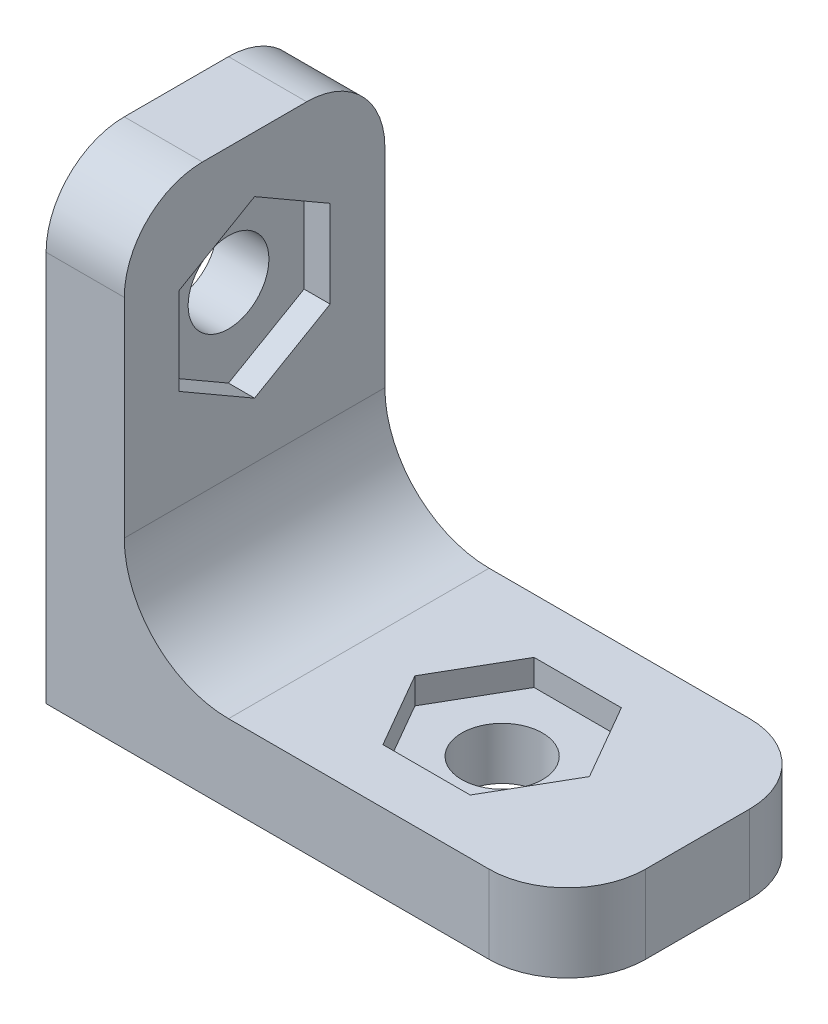
ISO-10303-21;
HEADER;
FILE_DESCRIPTION(('STEP AP214'),'2;1');
FILE_NAME('part.step','',(''),(''),'','','');
FILE_SCHEMA(('AUTOMOTIVE_DESIGN { 1 0 10303 214 1 1 1 1 }'));
ENDSEC;
DATA;
#1=APPLICATION_CONTEXT('core data for automotive mechanical design processes');
#2=APPLICATION_PROTOCOL_DEFINITION('international standard','automotive_design',2000,#1);
#3=PRODUCT_CONTEXT('',#1,'mechanical');
#4=PRODUCT('Part','Part','',(#3));
#5=PRODUCT_RELATED_PRODUCT_CATEGORY('part','',(#4));
#6=PRODUCT_DEFINITION_FORMATION('','',#4);
#7=PRODUCT_DEFINITION_CONTEXT('part definition',#1,'design');
#8=PRODUCT_DEFINITION('design','',#6,#7);
#9=PRODUCT_DEFINITION_SHAPE('','',#8);
#10=(LENGTH_UNIT() NAMED_UNIT(*) SI_UNIT(.MILLI.,.METRE.));
#11=(NAMED_UNIT(*) PLANE_ANGLE_UNIT() SI_UNIT($,.RADIAN.));
#12=(NAMED_UNIT(*) SI_UNIT($,.STERADIAN.) SOLID_ANGLE_UNIT());
#13=UNCERTAINTY_MEASURE_WITH_UNIT(LENGTH_MEASURE(1.E-05),#10,'distance_accuracy_value','');
#14=(GEOMETRIC_REPRESENTATION_CONTEXT(3) GLOBAL_UNCERTAINTY_ASSIGNED_CONTEXT((#13)) GLOBAL_UNIT_ASSIGNED_CONTEXT((#10,
#11,#12)) REPRESENTATION_CONTEXT('',''));
#15=CARTESIAN_POINT('',(0.,0.,0.));
#16=DIRECTION('',(0.,0.,1.));
#17=DIRECTION('',(1.,0.,0.));
#18=AXIS2_PLACEMENT_3D('',#15,#16,#17);
#19=CARTESIAN_POINT('',(12.5,3.,-5.));
#20=DIRECTION('',(0.,-1.,0.));
#21=DIRECTION('',(0.,0.,-1.));
#22=AXIS2_PLACEMENT_3D('',#19,#20,#21);
#23=CYLINDRICAL_SURFACE('',#22,1.55);
#24=CARTESIAN_POINT('',(12.5,0.,-5.));
#25=DIRECTION('',(0.,1.,0.));
#26=DIRECTION('',(0.,0.,1.));
#27=AXIS2_PLACEMENT_3D('',#24,#25,#26);
#28=CIRCLE('',#27,1.55);
#29=CARTESIAN_POINT('',(12.5,0.,-3.45));
#30=VERTEX_POINT('',#29);
#31=EDGE_CURVE('E309',#30,#30,#28,.T.);
#32=ORIENTED_EDGE('',*,*,#31,.F.);
#33=EDGE_LOOP('',(#32));
#34=FACE_BOUND('',#33,.T.);
#35=CARTESIAN_POINT('',(12.5,2.,-5.));
#36=DIRECTION('',(0.,1.,0.));
#37=DIRECTION('',(0.,0.,1.));
#38=AXIS2_PLACEMENT_3D('',#35,#36,#37);
#39=CIRCLE('',#38,1.55);
#40=CARTESIAN_POINT('',(12.5,2.,-3.45));
#41=VERTEX_POINT('',#40);
#42=EDGE_CURVE('E41',#41,#41,#39,.T.);
#43=ORIENTED_EDGE('',*,*,#42,.T.);
#44=EDGE_LOOP('',(#43));
#45=FACE_BOUND('',#44,.T.);
#46=ADVANCED_FACE('F37',(#34,#45),#23,.F.);
#47=CARTESIAN_POINT('',(7.3840620433566,12.5,-5.));
#48=DIRECTION('',(-1.,0.,0.));
#49=DIRECTION('',(0.,0.,1.));
#50=AXIS2_PLACEMENT_3D('',#47,#48,#49);
#51=CYLINDRICAL_SURFACE('',#50,1.55);
#52=CARTESIAN_POINT('',(0.,12.5,-5.));
#53=DIRECTION('',(-1.,0.,0.));
#54=DIRECTION('',(0.,0.,1.));
#55=AXIS2_PLACEMENT_3D('',#52,#53,#54);
#56=CIRCLE('',#55,1.55);
#57=CARTESIAN_POINT('',(0.,12.5,-3.45));
#58=VERTEX_POINT('',#57);
#59=EDGE_CURVE('E295',#58,#58,#56,.T.);
#60=ORIENTED_EDGE('',*,*,#59,.T.);
#61=EDGE_LOOP('',(#60));
#62=FACE_BOUND('',#61,.T.);
#63=CARTESIAN_POINT('',(2.,12.5,-5.));
#64=DIRECTION('',(1.,0.,0.));
#65=DIRECTION('',(0.,0.,-1.));
#66=AXIS2_PLACEMENT_3D('',#63,#64,#65);
#67=CIRCLE('',#66,1.55);
#68=CARTESIAN_POINT('',(2.,12.5,-6.55));
#69=VERTEX_POINT('',#68);
#70=EDGE_CURVE('E284',#69,#69,#67,.F.);
#71=ORIENTED_EDGE('',*,*,#70,.F.);
#72=EDGE_LOOP('',(#71));
#73=FACE_BOUND('',#72,.T.);
#74=ADVANCED_FACE('F438',(#62,#73),#51,.F.);
#75=CARTESIAN_POINT('',(0.,3.,0.));
#76=DIRECTION('',(0.,-1.,0.));
#77=DIRECTION('',(0.,0.,-1.));
#78=AXIS2_PLACEMENT_3D('',#75,#76,#77);
#79=PLANE('',#78);
#80=DIRECTION('',(-1.,0.,0.));
#81=VECTOR('',#80,1.);
#82=CARTESIAN_POINT('',(14.1743157806499,3.,-7.9));
#83=LINE('',#82,#81);
#84=CARTESIAN_POINT('',(14.1743157806499,3.,-7.9));
#85=VERTEX_POINT('',#84);
#86=CARTESIAN_POINT('',(10.8256842193501,3.,-7.9));
#87=VERTEX_POINT('',#86);
#88=EDGE_CURVE('E227',#85,#87,#83,.T.);
#89=ORIENTED_EDGE('',*,*,#88,.F.);
#90=DIRECTION('',(-0.500000000000001,0.,-0.866025403784438));
#91=VECTOR('',#90,1.);
#92=CARTESIAN_POINT('',(15.8486315612998,3.,-5.));
#93=LINE('',#92,#91);
#94=CARTESIAN_POINT('',(15.8486315612998,3.,-5.));
#95=VERTEX_POINT('',#94);
#96=EDGE_CURVE('E53',#95,#85,#93,.T.);
#97=ORIENTED_EDGE('',*,*,#96,.F.);
#98=DIRECTION('',(0.5,0.,-0.866025403784439));
#99=VECTOR('',#98,1.);
#100=CARTESIAN_POINT('',(14.1743157806499,3.,-2.1));
#101=LINE('',#100,#99);
#102=CARTESIAN_POINT('',(14.1743157806499,3.,-2.1));
#103=VERTEX_POINT('',#102);
#104=EDGE_CURVE('E213',#103,#95,#101,.T.);
#105=ORIENTED_EDGE('',*,*,#104,.F.);
#106=DIRECTION('',(1.,0.,0.));
#107=VECTOR('',#106,1.);
#108=CARTESIAN_POINT('',(10.8256842193501,3.,-2.1));
#109=LINE('',#108,#107);
#110=CARTESIAN_POINT('',(10.8256842193501,3.,-2.1));
#111=VERTEX_POINT('',#110);
#112=EDGE_CURVE('E216',#111,#103,#109,.T.);
#113=ORIENTED_EDGE('',*,*,#112,.F.);
#114=DIRECTION('',(0.5,0.,0.866025403784439));
#115=VECTOR('',#114,1.);
#116=CARTESIAN_POINT('',(9.15136843870017,3.,-5.));
#117=LINE('',#116,#115);
#118=CARTESIAN_POINT('',(9.15136843870017,3.,-5.));
#119=VERTEX_POINT('',#118);
#120=EDGE_CURVE('E232',#119,#111,#117,.T.);
#121=ORIENTED_EDGE('',*,*,#120,.F.);
#122=DIRECTION('',(-0.5,0.,0.866025403784439));
#123=VECTOR('',#122,1.);
#124=CARTESIAN_POINT('',(10.8256842193501,3.,-7.9));
#125=LINE('',#124,#123);
#126=EDGE_CURVE('E229',#87,#119,#125,.T.);
#127=ORIENTED_EDGE('',*,*,#126,.F.);
#128=EDGE_LOOP('',(#89,#97,#105,#113,#121,#127));
#129=FACE_BOUND('',#128,.T.);
#130=DIRECTION('',(-1.,0.,0.));
#131=VECTOR('',#130,1.);
#132=CARTESIAN_POINT('',(0.,3.,-10.));
#133=LINE('',#132,#131);
#134=CARTESIAN_POINT('',(17.,3.,-10.));
#135=VERTEX_POINT('',#134);
#136=CARTESIAN_POINT('',(7.,3.,-10.));
#137=VERTEX_POINT('',#136);
#138=EDGE_CURVE('E319',#135,#137,#133,.T.);
#139=ORIENTED_EDGE('',*,*,#138,.T.);
#140=DIRECTION('',(0.,0.,-1.));
#141=VECTOR('',#140,1.);
#142=CARTESIAN_POINT('',(7.,3.,0.));
#143=LINE('',#142,#141);
#144=CARTESIAN_POINT('',(7.,3.,0.));
#145=VERTEX_POINT('',#144);
#146=EDGE_CURVE('E377',#137,#145,#143,.F.);
#147=ORIENTED_EDGE('',*,*,#146,.T.);
#148=DIRECTION('',(1.,0.,0.));
#149=VECTOR('',#148,1.);
#150=CARTESIAN_POINT('',(0.,3.,0.));
#151=LINE('',#150,#149);
#152=CARTESIAN_POINT('',(17.,3.,0.));
#153=VERTEX_POINT('',#152);
#154=EDGE_CURVE('E313',#145,#153,#151,.T.);
#155=ORIENTED_EDGE('',*,*,#154,.T.);
#156=CARTESIAN_POINT('',(17.,3.,-3.));
#157=DIRECTION('',(0.,-1.,0.));
#158=DIRECTION('',(0.,0.,-1.));
#159=AXIS2_PLACEMENT_3D('',#156,#157,#158);
#160=CIRCLE('',#159,3.);
#161=CARTESIAN_POINT('',(20.,3.,-3.));
#162=VERTEX_POINT('',#161);
#163=EDGE_CURVE('E372',#153,#162,#160,.F.);
#164=ORIENTED_EDGE('',*,*,#163,.T.);
#165=DIRECTION('',(0.,0.,-1.));
#166=VECTOR('',#165,1.);
#167=CARTESIAN_POINT('',(20.,3.,0.));
#168=LINE('',#167,#166);
#169=CARTESIAN_POINT('',(20.,3.,-7.));
#170=VERTEX_POINT('',#169);
#171=EDGE_CURVE('E315',#162,#170,#168,.T.);
#172=ORIENTED_EDGE('',*,*,#171,.T.);
#173=CARTESIAN_POINT('',(17.,3.,-7.));
#174=DIRECTION('',(0.,-1.,0.));
#175=DIRECTION('',(0.,0.,-1.));
#176=AXIS2_PLACEMENT_3D('',#173,#174,#175);
#177=CIRCLE('',#176,3.);
#178=EDGE_CURVE('E370',#170,#135,#177,.F.);
#179=ORIENTED_EDGE('',*,*,#178,.T.);
#180=EDGE_LOOP('',(#139,#147,#155,#164,#172,#179));
#181=FACE_BOUND('',#180,.T.);
#182=ADVANCED_FACE('F382',(#129,#181),#79,.F.);
#183=CARTESIAN_POINT('',(0.,0.,0.));
#184=DIRECTION('',(0.,-1.,0.));
#185=DIRECTION('',(0.,0.,-1.));
#186=AXIS2_PLACEMENT_3D('',#183,#184,#185);
#187=PLANE('',#186);
#188=DIRECTION('',(0.,0.,-1.));
#189=VECTOR('',#188,1.);
#190=CARTESIAN_POINT('',(20.,0.,0.));
#191=LINE('',#190,#189);
#192=CARTESIAN_POINT('',(20.,0.,-3.));
#193=VERTEX_POINT('',#192);
#194=CARTESIAN_POINT('',(20.,0.,-7.));
#195=VERTEX_POINT('',#194);
#196=EDGE_CURVE('E327',#193,#195,#191,.T.);
#197=ORIENTED_EDGE('',*,*,#196,.F.);
#198=CARTESIAN_POINT('',(17.,0.,-3.));
#199=DIRECTION('',(0.,-1.,0.));
#200=DIRECTION('',(0.,0.,-1.));
#201=AXIS2_PLACEMENT_3D('',#198,#199,#200);
#202=CIRCLE('',#201,3.);
#203=CARTESIAN_POINT('',(17.,0.,0.));
#204=VERTEX_POINT('',#203);
#205=EDGE_CURVE('E368',#193,#204,#202,.T.);
#206=ORIENTED_EDGE('',*,*,#205,.T.);
#207=DIRECTION('',(1.,0.,0.));
#208=VECTOR('',#207,1.);
#209=CARTESIAN_POINT('',(0.,0.,0.));
#210=LINE('',#209,#208);
#211=CARTESIAN_POINT('',(0.,0.,0.));
#212=VERTEX_POINT('',#211);
#213=EDGE_CURVE('E324',#212,#204,#210,.T.);
#214=ORIENTED_EDGE('',*,*,#213,.F.);
#215=DIRECTION('',(0.,0.,1.));
#216=VECTOR('',#215,1.);
#217=CARTESIAN_POINT('',(0.,0.,0.));
#218=LINE('',#217,#216);
#219=CARTESIAN_POINT('',(0.,0.,-10.));
#220=VERTEX_POINT('',#219);
#221=EDGE_CURVE('E312',#220,#212,#218,.T.);
#222=ORIENTED_EDGE('',*,*,#221,.F.);
#223=DIRECTION('',(-1.,0.,0.));
#224=VECTOR('',#223,1.);
#225=CARTESIAN_POINT('',(0.,0.,-10.));
#226=LINE('',#225,#224);
#227=CARTESIAN_POINT('',(17.,0.,-10.));
#228=VERTEX_POINT('',#227);
#229=EDGE_CURVE('E316',#228,#220,#226,.T.);
#230=ORIENTED_EDGE('',*,*,#229,.F.);
#231=CARTESIAN_POINT('',(17.,0.,-7.));
#232=DIRECTION('',(0.,-1.,0.));
#233=DIRECTION('',(0.,0.,-1.));
#234=AXIS2_PLACEMENT_3D('',#231,#232,#233);
#235=CIRCLE('',#234,3.);
#236=EDGE_CURVE('E366',#228,#195,#235,.T.);
#237=ORIENTED_EDGE('',*,*,#236,.T.);
#238=EDGE_LOOP('',(#197,#206,#214,#222,#230,#237));
#239=FACE_BOUND('',#238,.T.);
#240=ORIENTED_EDGE('',*,*,#31,.T.);
#241=EDGE_LOOP('',(#240));
#242=FACE_BOUND('',#241,.T.);
#243=ADVANCED_FACE('F418',(#239,#242),#187,.T.);
#244=CARTESIAN_POINT('',(0.,3.,0.));
#245=DIRECTION('',(1.,0.,0.));
#246=DIRECTION('',(0.,0.,-1.));
#247=AXIS2_PLACEMENT_3D('',#244,#245,#246);
#248=PLANE('',#247);
#249=ORIENTED_EDGE('',*,*,#59,.F.);
#250=EDGE_LOOP('',(#249));
#251=FACE_BOUND('',#250,.T.);
#252=DIRECTION('',(0.,0.,1.));
#253=VECTOR('',#252,1.);
#254=CARTESIAN_POINT('',(0.,18.,-10.));
#255=LINE('',#254,#253);
#256=CARTESIAN_POINT('',(0.,18.,-7.));
#257=VERTEX_POINT('',#256);
#258=CARTESIAN_POINT('',(0.,18.,-3.));
#259=VERTEX_POINT('',#258);
#260=EDGE_CURVE('E298',#257,#259,#255,.T.);
#261=ORIENTED_EDGE('',*,*,#260,.F.);
#262=CARTESIAN_POINT('',(0.,15.,-7.));
#263=DIRECTION('',(1.,0.,0.));
#264=DIRECTION('',(0.,0.,-1.));
#265=AXIS2_PLACEMENT_3D('',#262,#263,#264);
#266=CIRCLE('',#265,3.);
#267=CARTESIAN_POINT('',(0.,15.,-10.));
#268=VERTEX_POINT('',#267);
#269=EDGE_CURVE('E345',#257,#268,#266,.F.);
#270=ORIENTED_EDGE('',*,*,#269,.T.);
#271=DIRECTION('',(0.,-1.,0.));
#272=VECTOR('',#271,1.);
#273=CARTESIAN_POINT('',(0.,3.,-10.));
#274=LINE('',#273,#272);
#275=EDGE_CURVE('E321',#268,#220,#274,.T.);
#276=ORIENTED_EDGE('',*,*,#275,.T.);
#277=ORIENTED_EDGE('',*,*,#221,.T.);
#278=DIRECTION('',(0.,-1.,0.));
#279=VECTOR('',#278,1.);
#280=CARTESIAN_POINT('',(0.,3.,0.));
#281=LINE('',#280,#279);
#282=CARTESIAN_POINT('',(0.,15.,0.));
#283=VERTEX_POINT('',#282);
#284=EDGE_CURVE('E333',#283,#212,#281,.T.);
#285=ORIENTED_EDGE('',*,*,#284,.F.);
#286=CARTESIAN_POINT('',(0.,15.,-3.));
#287=DIRECTION('',(1.,0.,0.));
#288=DIRECTION('',(0.,0.,-1.));
#289=AXIS2_PLACEMENT_3D('',#286,#287,#288);
#290=CIRCLE('',#289,3.);
#291=EDGE_CURVE('E343',#283,#259,#290,.F.);
#292=ORIENTED_EDGE('',*,*,#291,.T.);
#293=EDGE_LOOP('',(#261,#270,#276,#277,#285,#292));
#294=FACE_BOUND('',#293,.T.);
#295=ADVANCED_FACE('F413',(#251,#294),#248,.F.);
#296=CARTESIAN_POINT('',(0.,3.,0.));
#297=DIRECTION('',(0.,0.,-1.));
#298=DIRECTION('',(-1.,0.,0.));
#299=AXIS2_PLACEMENT_3D('',#296,#297,#298);
#300=PLANE('',#299);
#301=DIRECTION('',(0.,-1.,0.));
#302=VECTOR('',#301,1.);
#303=CARTESIAN_POINT('',(3.,18.,0.));
#304=LINE('',#303,#302);
#305=CARTESIAN_POINT('',(3.,15.,0.));
#306=VERTEX_POINT('',#305);
#307=CARTESIAN_POINT('',(3.,7.,0.));
#308=VERTEX_POINT('',#307);
#309=EDGE_CURVE('E306',#306,#308,#304,.T.);
#310=ORIENTED_EDGE('',*,*,#309,.F.);
#311=DIRECTION('',(1.,0.,0.));
#312=VECTOR('',#311,1.);
#313=CARTESIAN_POINT('',(0.,15.,0.));
#314=LINE('',#313,#312);
#315=EDGE_CURVE('E359',#306,#283,#314,.F.);
#316=ORIENTED_EDGE('',*,*,#315,.T.);
#317=ORIENTED_EDGE('',*,*,#284,.T.);
#318=ORIENTED_EDGE('',*,*,#213,.T.);
#319=DIRECTION('',(0.,-1.,0.));
#320=VECTOR('',#319,1.);
#321=CARTESIAN_POINT('',(17.,3.,0.));
#322=LINE('',#321,#320);
#323=EDGE_CURVE('E356',#204,#153,#322,.F.);
#324=ORIENTED_EDGE('',*,*,#323,.T.);
#325=ORIENTED_EDGE('',*,*,#154,.F.);
#326=CARTESIAN_POINT('',(7.,7.,0.));
#327=DIRECTION('',(0.,0.,-1.));
#328=DIRECTION('',(-1.,0.,0.));
#329=AXIS2_PLACEMENT_3D('',#326,#327,#328);
#330=CIRCLE('',#329,4.);
#331=EDGE_CURVE('E11',#145,#308,#330,.T.);
#332=ORIENTED_EDGE('',*,*,#331,.T.);
#333=EDGE_LOOP('',(#310,#316,#317,#318,#324,#325,#332));
#334=FACE_BOUND('',#333,.T.);
#335=ADVANCED_FACE('F387',(#334),#300,.F.);
#336=CARTESIAN_POINT('',(20.,3.,0.));
#337=DIRECTION('',(-1.,0.,0.));
#338=DIRECTION('',(0.,0.,1.));
#339=AXIS2_PLACEMENT_3D('',#336,#337,#338);
#340=PLANE('',#339);
#341=ORIENTED_EDGE('',*,*,#171,.F.);
#342=DIRECTION('',(0.,-1.,0.));
#343=VECTOR('',#342,1.);
#344=CARTESIAN_POINT('',(20.,3.,-3.));
#345=LINE('',#344,#343);
#346=EDGE_CURVE('E363',#162,#193,#345,.T.);
#347=ORIENTED_EDGE('',*,*,#346,.T.);
#348=ORIENTED_EDGE('',*,*,#196,.T.);
#349=DIRECTION('',(0.,-1.,0.));
#350=VECTOR('',#349,1.);
#351=CARTESIAN_POINT('',(20.,3.,-7.));
#352=LINE('',#351,#350);
#353=EDGE_CURVE('E361',#195,#170,#352,.F.);
#354=ORIENTED_EDGE('',*,*,#353,.T.);
#355=EDGE_LOOP('',(#341,#347,#348,#354));
#356=FACE_BOUND('',#355,.T.);
#357=ADVANCED_FACE('F426',(#356),#340,.F.);
#358=CARTESIAN_POINT('',(0.,3.,-10.));
#359=DIRECTION('',(0.,0.,1.));
#360=DIRECTION('',(1.,0.,0.));
#361=AXIS2_PLACEMENT_3D('',#358,#359,#360);
#362=PLANE('',#361);
#363=ORIENTED_EDGE('',*,*,#275,.F.);
#364=DIRECTION('',(-1.,0.,0.));
#365=VECTOR('',#364,1.);
#366=CARTESIAN_POINT('',(3.,15.,-10.));
#367=LINE('',#366,#365);
#368=CARTESIAN_POINT('',(3.,15.,-10.));
#369=VERTEX_POINT('',#368);
#370=EDGE_CURVE('E350',#268,#369,#367,.F.);
#371=ORIENTED_EDGE('',*,*,#370,.T.);
#372=DIRECTION('',(0.,-1.,0.));
#373=VECTOR('',#372,1.);
#374=CARTESIAN_POINT('',(3.,18.,-10.));
#375=LINE('',#374,#373);
#376=CARTESIAN_POINT('',(3.,7.,-10.));
#377=VERTEX_POINT('',#376);
#378=EDGE_CURVE('E304',#369,#377,#375,.T.);
#379=ORIENTED_EDGE('',*,*,#378,.T.);
#380=CARTESIAN_POINT('',(7.,7.,-10.));
#381=DIRECTION('',(0.,0.,1.));
#382=DIRECTION('',(1.,0.,0.));
#383=AXIS2_PLACEMENT_3D('',#380,#381,#382);
#384=CIRCLE('',#383,4.);
#385=EDGE_CURVE('E46',#377,#137,#384,.T.);
#386=ORIENTED_EDGE('',*,*,#385,.T.);
#387=ORIENTED_EDGE('',*,*,#138,.F.);
#388=DIRECTION('',(0.,-1.,0.));
#389=VECTOR('',#388,1.);
#390=CARTESIAN_POINT('',(17.,3.,-10.));
#391=LINE('',#390,#389);
#392=EDGE_CURVE('E347',#135,#228,#391,.T.);
#393=ORIENTED_EDGE('',*,*,#392,.T.);
#394=ORIENTED_EDGE('',*,*,#229,.T.);
#395=EDGE_LOOP('',(#363,#371,#379,#386,#387,#393,#394));
#396=FACE_BOUND('',#395,.T.);
#397=ADVANCED_FACE('F396',(#396),#362,.F.);
#398=CARTESIAN_POINT('',(3.,18.,-10.));
#399=DIRECTION('',(-1.,0.,0.));
#400=DIRECTION('',(0.,0.,1.));
#401=AXIS2_PLACEMENT_3D('',#398,#399,#400);
#402=PLANE('',#401);
#403=DIRECTION('',(0.,0.5,0.866025403784439));
#404=VECTOR('',#403,1.);
#405=CARTESIAN_POINT('',(3.,14.1743157806499,-7.9));
#406=LINE('',#405,#404);
#407=CARTESIAN_POINT('',(3.,14.1743157806499,-7.9));
#408=VERTEX_POINT('',#407);
#409=CARTESIAN_POINT('',(3.,15.8486315612998,-5.));
#410=VERTEX_POINT('',#409);
#411=EDGE_CURVE('E268',#408,#410,#406,.T.);
#412=ORIENTED_EDGE('',*,*,#411,.F.);
#413=DIRECTION('',(0.,1.,0.));
#414=VECTOR('',#413,1.);
#415=CARTESIAN_POINT('',(3.,10.8256842193501,-7.9));
#416=LINE('',#415,#414);
#417=CARTESIAN_POINT('',(3.,10.8256842193501,-7.9));
#418=VERTEX_POINT('',#417);
#419=EDGE_CURVE('E266',#418,#408,#416,.T.);
#420=ORIENTED_EDGE('',*,*,#419,.F.);
#421=DIRECTION('',(0.,0.5,-0.866025403784439));
#422=VECTOR('',#421,1.);
#423=CARTESIAN_POINT('',(3.,9.15136843870017,-5.));
#424=LINE('',#423,#422);
#425=CARTESIAN_POINT('',(3.,9.15136843870017,-5.));
#426=VERTEX_POINT('',#425);
#427=EDGE_CURVE('E250',#426,#418,#424,.T.);
#428=ORIENTED_EDGE('',*,*,#427,.F.);
#429=DIRECTION('',(0.,-0.5,-0.866025403784439));
#430=VECTOR('',#429,1.);
#431=CARTESIAN_POINT('',(3.,10.8256842193501,-2.1));
#432=LINE('',#431,#430);
#433=CARTESIAN_POINT('',(3.,10.8256842193501,-2.1));
#434=VERTEX_POINT('',#433);
#435=EDGE_CURVE('E277',#434,#426,#432,.T.);
#436=ORIENTED_EDGE('',*,*,#435,.F.);
#437=DIRECTION('',(0.,-1.,0.));
#438=VECTOR('',#437,1.);
#439=CARTESIAN_POINT('',(3.,14.1743157806499,-2.1));
#440=LINE('',#439,#438);
#441=CARTESIAN_POINT('',(3.,14.1743157806499,-2.1));
#442=VERTEX_POINT('',#441);
#443=EDGE_CURVE('E274',#442,#434,#440,.T.);
#444=ORIENTED_EDGE('',*,*,#443,.F.);
#445=DIRECTION('',(0.,-0.5,0.866025403784439));
#446=VECTOR('',#445,1.);
#447=CARTESIAN_POINT('',(3.,15.8486315612998,-5.));
#448=LINE('',#447,#446);
#449=EDGE_CURVE('E271',#410,#442,#448,.T.);
#450=ORIENTED_EDGE('',*,*,#449,.F.);
#451=EDGE_LOOP('',(#412,#420,#428,#436,#444,#450));
#452=FACE_BOUND('',#451,.T.);
#453=ORIENTED_EDGE('',*,*,#309,.T.);
#454=DIRECTION('',(0.,0.,-1.));
#455=VECTOR('',#454,1.);
#456=CARTESIAN_POINT('',(3.,7.,-10.));
#457=LINE('',#456,#455);
#458=EDGE_CURVE('E374',#308,#377,#457,.T.);
#459=ORIENTED_EDGE('',*,*,#458,.T.);
#460=ORIENTED_EDGE('',*,*,#378,.F.);
#461=CARTESIAN_POINT('',(3.,15.,-7.));
#462=DIRECTION('',(-1.,0.,0.));
#463=DIRECTION('',(0.,0.,1.));
#464=AXIS2_PLACEMENT_3D('',#461,#462,#463);
#465=CIRCLE('',#464,3.);
#466=CARTESIAN_POINT('',(3.,18.,-7.));
#467=VERTEX_POINT('',#466);
#468=EDGE_CURVE('E354',#369,#467,#465,.F.);
#469=ORIENTED_EDGE('',*,*,#468,.T.);
#470=DIRECTION('',(0.,0.,-1.));
#471=VECTOR('',#470,1.);
#472=CARTESIAN_POINT('',(3.,18.,-10.));
#473=LINE('',#472,#471);
#474=CARTESIAN_POINT('',(3.,18.,-3.));
#475=VERTEX_POINT('',#474);
#476=EDGE_CURVE('E301',#475,#467,#473,.T.);
#477=ORIENTED_EDGE('',*,*,#476,.F.);
#478=CARTESIAN_POINT('',(3.,15.,-3.));
#479=DIRECTION('',(-1.,0.,0.));
#480=DIRECTION('',(0.,0.,1.));
#481=AXIS2_PLACEMENT_3D('',#478,#479,#480);
#482=CIRCLE('',#481,3.);
#483=EDGE_CURVE('E352',#475,#306,#482,.F.);
#484=ORIENTED_EDGE('',*,*,#483,.T.);
#485=EDGE_LOOP('',(#453,#459,#460,#469,#477,#484));
#486=FACE_BOUND('',#485,.T.);
#487=ADVANCED_FACE('F393',(#452,#486),#402,.F.);
#488=CARTESIAN_POINT('',(0.,18.,0.));
#489=DIRECTION('',(0.,1.,0.));
#490=DIRECTION('',(0.,0.,1.));
#491=AXIS2_PLACEMENT_3D('',#488,#489,#490);
#492=PLANE('',#491);
#493=ORIENTED_EDGE('',*,*,#476,.T.);
#494=DIRECTION('',(-1.,0.,0.));
#495=VECTOR('',#494,1.);
#496=CARTESIAN_POINT('',(0.,18.,-7.));
#497=LINE('',#496,#495);
#498=EDGE_CURVE('E340',#467,#257,#497,.T.);
#499=ORIENTED_EDGE('',*,*,#498,.T.);
#500=ORIENTED_EDGE('',*,*,#260,.T.);
#501=DIRECTION('',(1.,0.,0.));
#502=VECTOR('',#501,1.);
#503=CARTESIAN_POINT('',(3.,18.,-3.));
#504=LINE('',#503,#502);
#505=EDGE_CURVE('E335',#259,#475,#504,.T.);
#506=ORIENTED_EDGE('',*,*,#505,.T.);
#507=EDGE_LOOP('',(#493,#499,#500,#506));
#508=FACE_BOUND('',#507,.T.);
#509=ADVANCED_FACE('F403',(#508),#492,.T.);
#510=CARTESIAN_POINT('',(2.,0.,0.));
#511=DIRECTION('',(1.,0.,0.));
#512=DIRECTION('',(0.,0.,-1.));
#513=AXIS2_PLACEMENT_3D('',#510,#511,#512);
#514=PLANE('',#513);
#515=DIRECTION('',(0.,1.,0.));
#516=VECTOR('',#515,1.);
#517=CARTESIAN_POINT('',(2.,10.8256842193501,-7.9));
#518=LINE('',#517,#516);
#519=CARTESIAN_POINT('',(2.,10.8256842193501,-7.9));
#520=VERTEX_POINT('',#519);
#521=CARTESIAN_POINT('',(2.,14.1743157806499,-7.9));
#522=VERTEX_POINT('',#521);
#523=EDGE_CURVE('E246',#520,#522,#518,.T.);
#524=ORIENTED_EDGE('',*,*,#523,.T.);
#525=DIRECTION('',(0.,0.5,0.866025403784439));
#526=VECTOR('',#525,1.);
#527=CARTESIAN_POINT('',(2.,14.1743157806499,-7.9));
#528=LINE('',#527,#526);
#529=CARTESIAN_POINT('',(2.,15.8486315612998,-5.));
#530=VERTEX_POINT('',#529);
#531=EDGE_CURVE('E249',#522,#530,#528,.T.);
#532=ORIENTED_EDGE('',*,*,#531,.T.);
#533=DIRECTION('',(0.,-0.5,0.866025403784439));
#534=VECTOR('',#533,1.);
#535=CARTESIAN_POINT('',(2.,15.8486315612998,-5.));
#536=LINE('',#535,#534);
#537=CARTESIAN_POINT('',(2.,14.1743157806499,-2.1));
#538=VERTEX_POINT('',#537);
#539=EDGE_CURVE('E253',#530,#538,#536,.T.);
#540=ORIENTED_EDGE('',*,*,#539,.T.);
#541=DIRECTION('',(0.,-1.,0.));
#542=VECTOR('',#541,1.);
#543=CARTESIAN_POINT('',(2.,14.1743157806499,-2.1));
#544=LINE('',#543,#542);
#545=CARTESIAN_POINT('',(2.,10.8256842193501,-2.1));
#546=VERTEX_POINT('',#545);
#547=EDGE_CURVE('E256',#538,#546,#544,.T.);
#548=ORIENTED_EDGE('',*,*,#547,.T.);
#549=DIRECTION('',(0.,-0.5,-0.866025403784439));
#550=VECTOR('',#549,1.);
#551=CARTESIAN_POINT('',(2.,10.8256842193501,-2.1));
#552=LINE('',#551,#550);
#553=CARTESIAN_POINT('',(2.,9.15136843870017,-5.));
#554=VERTEX_POINT('',#553);
#555=EDGE_CURVE('E259',#546,#554,#552,.T.);
#556=ORIENTED_EDGE('',*,*,#555,.T.);
#557=DIRECTION('',(0.,0.5,-0.866025403784439));
#558=VECTOR('',#557,1.);
#559=CARTESIAN_POINT('',(2.,9.15136843870017,-5.));
#560=LINE('',#559,#558);
#561=EDGE_CURVE('E262',#554,#520,#560,.T.);
#562=ORIENTED_EDGE('',*,*,#561,.T.);
#563=EDGE_LOOP('',(#524,#532,#540,#548,#556,#562));
#564=FACE_BOUND('',#563,.T.);
#565=ORIENTED_EDGE('',*,*,#70,.T.);
#566=EDGE_LOOP('',(#565));
#567=FACE_BOUND('',#566,.T.);
#568=ADVANCED_FACE('F588',(#564,#567),#514,.T.);
#569=CARTESIAN_POINT('',(2.,10.8256842193501,-7.9));
#570=DIRECTION('',(0.,0.,-1.));
#571=DIRECTION('',(-1.,0.,0.));
#572=AXIS2_PLACEMENT_3D('',#569,#570,#571);
#573=PLANE('',#572);
#574=ORIENTED_EDGE('',*,*,#419,.T.);
#575=DIRECTION('',(1.,0.,0.));
#576=VECTOR('',#575,1.);
#577=CARTESIAN_POINT('',(2.,14.1743157806499,-7.9));
#578=LINE('',#577,#576);
#579=EDGE_CURVE('E265',#522,#408,#578,.T.);
#580=ORIENTED_EDGE('',*,*,#579,.F.);
#581=ORIENTED_EDGE('',*,*,#523,.F.);
#582=DIRECTION('',(1.,0.,0.));
#583=VECTOR('',#582,1.);
#584=CARTESIAN_POINT('',(2.,10.8256842193501,-7.9));
#585=LINE('',#584,#583);
#586=EDGE_CURVE('E282',#520,#418,#585,.T.);
#587=ORIENTED_EDGE('',*,*,#586,.T.);
#588=EDGE_LOOP('',(#574,#580,#581,#587));
#589=FACE_BOUND('',#588,.T.);
#590=ADVANCED_FACE('F591',(#589),#573,.F.);
#591=CARTESIAN_POINT('',(2.,9.15136843870017,-5.));
#592=DIRECTION('',(0.,-0.866025403784439,-0.5));
#593=DIRECTION('',(0.,0.5,-0.866025403784439));
#594=AXIS2_PLACEMENT_3D('',#591,#592,#593);
#595=PLANE('',#594);
#596=ORIENTED_EDGE('',*,*,#427,.T.);
#597=ORIENTED_EDGE('',*,*,#586,.F.);
#598=ORIENTED_EDGE('',*,*,#561,.F.);
#599=DIRECTION('',(1.,0.,0.));
#600=VECTOR('',#599,1.);
#601=CARTESIAN_POINT('',(2.,9.15136843870017,-5.));
#602=LINE('',#601,#600);
#603=EDGE_CURVE('E285',#554,#426,#602,.T.);
#604=ORIENTED_EDGE('',*,*,#603,.T.);
#605=EDGE_LOOP('',(#596,#597,#598,#604));
#606=FACE_BOUND('',#605,.T.);
#607=ADVANCED_FACE('F593',(#606),#595,.F.);
#608=CARTESIAN_POINT('',(2.,10.8256842193501,-2.1));
#609=DIRECTION('',(0.,-0.866025403784439,0.5));
#610=DIRECTION('',(0.,-0.5,-0.866025403784439));
#611=AXIS2_PLACEMENT_3D('',#608,#609,#610);
#612=PLANE('',#611);
#613=ORIENTED_EDGE('',*,*,#435,.T.);
#614=ORIENTED_EDGE('',*,*,#603,.F.);
#615=ORIENTED_EDGE('',*,*,#555,.F.);
#616=DIRECTION('',(1.,0.,0.));
#617=VECTOR('',#616,1.);
#618=CARTESIAN_POINT('',(2.,10.8256842193501,-2.1));
#619=LINE('',#618,#617);
#620=EDGE_CURVE('E287',#546,#434,#619,.T.);
#621=ORIENTED_EDGE('',*,*,#620,.T.);
#622=EDGE_LOOP('',(#613,#614,#615,#621));
#623=FACE_BOUND('',#622,.T.);
#624=ADVANCED_FACE('F596',(#623),#612,.F.);
#625=CARTESIAN_POINT('',(2.,14.1743157806499,-2.1));
#626=DIRECTION('',(0.,0.,1.));
#627=DIRECTION('',(1.,0.,0.));
#628=AXIS2_PLACEMENT_3D('',#625,#626,#627);
#629=PLANE('',#628);
#630=ORIENTED_EDGE('',*,*,#443,.T.);
#631=ORIENTED_EDGE('',*,*,#620,.F.);
#632=ORIENTED_EDGE('',*,*,#547,.F.);
#633=DIRECTION('',(1.,0.,0.));
#634=VECTOR('',#633,1.);
#635=CARTESIAN_POINT('',(2.,14.1743157806499,-2.1));
#636=LINE('',#635,#634);
#637=EDGE_CURVE('E289',#538,#442,#636,.T.);
#638=ORIENTED_EDGE('',*,*,#637,.T.);
#639=EDGE_LOOP('',(#630,#631,#632,#638));
#640=FACE_BOUND('',#639,.T.);
#641=ADVANCED_FACE('F600',(#640),#629,.F.);
#642=CARTESIAN_POINT('',(2.,15.8486315612998,-5.));
#643=DIRECTION('',(0.,0.866025403784439,0.5));
#644=DIRECTION('',(0.,-0.5,0.866025403784439));
#645=AXIS2_PLACEMENT_3D('',#642,#643,#644);
#646=PLANE('',#645);
#647=ORIENTED_EDGE('',*,*,#449,.T.);
#648=ORIENTED_EDGE('',*,*,#637,.F.);
#649=ORIENTED_EDGE('',*,*,#539,.F.);
#650=DIRECTION('',(1.,0.,0.));
#651=VECTOR('',#650,1.);
#652=CARTESIAN_POINT('',(2.,15.8486315612998,-5.));
#653=LINE('',#652,#651);
#654=EDGE_CURVE('E291',#530,#410,#653,.T.);
#655=ORIENTED_EDGE('',*,*,#654,.T.);
#656=EDGE_LOOP('',(#647,#648,#649,#655));
#657=FACE_BOUND('',#656,.T.);
#658=ADVANCED_FACE('F604',(#657),#646,.F.);
#659=CARTESIAN_POINT('',(2.,14.1743157806499,-7.9));
#660=DIRECTION('',(0.,0.866025403784439,-0.5));
#661=DIRECTION('',(0.,0.5,0.866025403784439));
#662=AXIS2_PLACEMENT_3D('',#659,#660,#661);
#663=PLANE('',#662);
#664=ORIENTED_EDGE('',*,*,#411,.T.);
#665=ORIENTED_EDGE('',*,*,#654,.F.);
#666=ORIENTED_EDGE('',*,*,#531,.F.);
#667=ORIENTED_EDGE('',*,*,#579,.T.);
#668=EDGE_LOOP('',(#664,#665,#666,#667));
#669=FACE_BOUND('',#668,.T.);
#670=ADVANCED_FACE('F468',(#669),#663,.F.);
#671=CARTESIAN_POINT('',(0.,15.,-7.));
#672=DIRECTION('',(1.,0.,0.));
#673=DIRECTION('',(0.,0.,-1.));
#674=AXIS2_PLACEMENT_3D('',#671,#672,#673);
#675=CYLINDRICAL_SURFACE('',#674,3.);
#676=ORIENTED_EDGE('',*,*,#468,.F.);
#677=ORIENTED_EDGE('',*,*,#370,.F.);
#678=ORIENTED_EDGE('',*,*,#269,.F.);
#679=ORIENTED_EDGE('',*,*,#498,.F.);
#680=EDGE_LOOP('',(#676,#677,#678,#679));
#681=FACE_BOUND('',#680,.T.);
#682=ADVANCED_FACE('F399',(#681),#675,.T.);
#683=CARTESIAN_POINT('',(0.,15.,-3.));
#684=DIRECTION('',(-1.,0.,0.));
#685=DIRECTION('',(0.,0.,1.));
#686=AXIS2_PLACEMENT_3D('',#683,#684,#685);
#687=CYLINDRICAL_SURFACE('',#686,3.);
#688=ORIENTED_EDGE('',*,*,#291,.F.);
#689=ORIENTED_EDGE('',*,*,#315,.F.);
#690=ORIENTED_EDGE('',*,*,#483,.F.);
#691=ORIENTED_EDGE('',*,*,#505,.F.);
#692=EDGE_LOOP('',(#688,#689,#690,#691));
#693=FACE_BOUND('',#692,.T.);
#694=ADVANCED_FACE('F408',(#693),#687,.T.);
#695=CARTESIAN_POINT('',(17.,3.,-3.));
#696=DIRECTION('',(0.,-1.,0.));
#697=DIRECTION('',(0.,0.,-1.));
#698=AXIS2_PLACEMENT_3D('',#695,#696,#697);
#699=CYLINDRICAL_SURFACE('',#698,3.);
#700=ORIENTED_EDGE('',*,*,#163,.F.);
#701=ORIENTED_EDGE('',*,*,#323,.F.);
#702=ORIENTED_EDGE('',*,*,#205,.F.);
#703=ORIENTED_EDGE('',*,*,#346,.F.);
#704=EDGE_LOOP('',(#700,#701,#702,#703));
#705=FACE_BOUND('',#704,.T.);
#706=ADVANCED_FACE('F421',(#705),#699,.T.);
#707=CARTESIAN_POINT('',(17.,3.,-7.));
#708=DIRECTION('',(0.,-1.,0.));
#709=DIRECTION('',(0.,0.,-1.));
#710=AXIS2_PLACEMENT_3D('',#707,#708,#709);
#711=CYLINDRICAL_SURFACE('',#710,3.);
#712=ORIENTED_EDGE('',*,*,#178,.F.);
#713=ORIENTED_EDGE('',*,*,#353,.F.);
#714=ORIENTED_EDGE('',*,*,#236,.F.);
#715=ORIENTED_EDGE('',*,*,#392,.F.);
#716=EDGE_LOOP('',(#712,#713,#714,#715));
#717=FACE_BOUND('',#716,.T.);
#718=ADVANCED_FACE('F429',(#717),#711,.T.);
#719=CARTESIAN_POINT('',(7.,7.,-10.));
#720=DIRECTION('',(0.,0.,1.));
#721=DIRECTION('',(1.,0.,0.));
#722=AXIS2_PLACEMENT_3D('',#719,#720,#721);
#723=CYLINDRICAL_SURFACE('',#722,4.);
#724=ORIENTED_EDGE('',*,*,#331,.F.);
#725=ORIENTED_EDGE('',*,*,#146,.F.);
#726=ORIENTED_EDGE('',*,*,#385,.F.);
#727=ORIENTED_EDGE('',*,*,#458,.F.);
#728=EDGE_LOOP('',(#724,#725,#726,#727));
#729=FACE_BOUND('',#728,.T.);
#730=ADVANCED_FACE('F39',(#729),#723,.F.);
#731=CARTESIAN_POINT('',(15.8486315612998,2.,-5.));
#732=DIRECTION('',(0.866025403784438,0.,-0.500000000000001));
#733=DIRECTION('',(-0.500000000000001,0.,-0.866025403784438));
#734=AXIS2_PLACEMENT_3D('',#731,#732,#733);
#735=PLANE('',#734);
#736=ORIENTED_EDGE('',*,*,#96,.T.);
#737=DIRECTION('',(0.,1.,0.));
#738=VECTOR('',#737,1.);
#739=CARTESIAN_POINT('',(14.1743157806499,2.,-7.9));
#740=LINE('',#739,#738);
#741=CARTESIAN_POINT('',(14.1743157806499,2.,-7.9));
#742=VERTEX_POINT('',#741);
#743=EDGE_CURVE('E190',#742,#85,#740,.T.);
#744=ORIENTED_EDGE('',*,*,#743,.F.);
#745=DIRECTION('',(-0.500000000000001,0.,-0.866025403784438));
#746=VECTOR('',#745,1.);
#747=CARTESIAN_POINT('',(15.8486315612998,2.,-5.));
#748=LINE('',#747,#746);
#749=CARTESIAN_POINT('',(15.8486315612998,2.,-5.));
#750=VERTEX_POINT('',#749);
#751=EDGE_CURVE('E194',#750,#742,#748,.T.);
#752=ORIENTED_EDGE('',*,*,#751,.F.);
#753=DIRECTION('',(0.,1.,0.));
#754=VECTOR('',#753,1.);
#755=CARTESIAN_POINT('',(15.8486315612998,2.,-5.));
#756=LINE('',#755,#754);
#757=EDGE_CURVE('E237',#750,#95,#756,.T.);
#758=ORIENTED_EDGE('',*,*,#757,.T.);
#759=EDGE_LOOP('',(#736,#744,#752,#758));
#760=FACE_BOUND('',#759,.T.);
#761=ADVANCED_FACE('F192',(#760),#735,.F.);
#762=CARTESIAN_POINT('',(14.1743157806499,2.,-2.1));
#763=DIRECTION('',(0.866025403784439,0.,0.5));
#764=DIRECTION('',(0.5,0.,-0.866025403784439));
#765=AXIS2_PLACEMENT_3D('',#762,#763,#764);
#766=PLANE('',#765);
#767=ORIENTED_EDGE('',*,*,#104,.T.);
#768=ORIENTED_EDGE('',*,*,#757,.F.);
#769=DIRECTION('',(0.5,0.,-0.866025403784439));
#770=VECTOR('',#769,1.);
#771=CARTESIAN_POINT('',(14.1743157806499,2.,-2.1));
#772=LINE('',#771,#770);
#773=CARTESIAN_POINT('',(14.1743157806499,2.,-2.1));
#774=VERTEX_POINT('',#773);
#775=EDGE_CURVE('E200',#774,#750,#772,.T.);
#776=ORIENTED_EDGE('',*,*,#775,.F.);
#777=DIRECTION('',(0.,1.,0.));
#778=VECTOR('',#777,1.);
#779=CARTESIAN_POINT('',(14.1743157806499,2.,-2.1));
#780=LINE('',#779,#778);
#781=EDGE_CURVE('E239',#774,#103,#780,.T.);
#782=ORIENTED_EDGE('',*,*,#781,.T.);
#783=EDGE_LOOP('',(#767,#768,#776,#782));
#784=FACE_BOUND('',#783,.T.);
#785=ADVANCED_FACE('F526',(#784),#766,.F.);
#786=CARTESIAN_POINT('',(10.8256842193501,2.,-2.1));
#787=DIRECTION('',(0.,0.,1.));
#788=DIRECTION('',(1.,0.,0.));
#789=AXIS2_PLACEMENT_3D('',#786,#787,#788);
#790=PLANE('',#789);
#791=ORIENTED_EDGE('',*,*,#112,.T.);
#792=ORIENTED_EDGE('',*,*,#781,.F.);
#793=DIRECTION('',(1.,0.,0.));
#794=VECTOR('',#793,1.);
#795=CARTESIAN_POINT('',(10.8256842193501,2.,-2.1));
#796=LINE('',#795,#794);
#797=CARTESIAN_POINT('',(10.8256842193501,2.,-2.1));
#798=VERTEX_POINT('',#797);
#799=EDGE_CURVE('E223',#798,#774,#796,.T.);
#800=ORIENTED_EDGE('',*,*,#799,.F.);
#801=DIRECTION('',(0.,1.,0.));
#802=VECTOR('',#801,1.);
#803=CARTESIAN_POINT('',(10.8256842193501,2.,-2.1));
#804=LINE('',#803,#802);
#805=EDGE_CURVE('E241',#798,#111,#804,.T.);
#806=ORIENTED_EDGE('',*,*,#805,.T.);
#807=EDGE_LOOP('',(#791,#792,#800,#806));
#808=FACE_BOUND('',#807,.T.);
#809=ADVANCED_FACE('F532',(#808),#790,.F.);
#810=CARTESIAN_POINT('',(9.15136843870017,2.,-5.));
#811=DIRECTION('',(-0.866025403784439,0.,0.5));
#812=DIRECTION('',(0.5,0.,0.866025403784439));
#813=AXIS2_PLACEMENT_3D('',#810,#811,#812);
#814=PLANE('',#813);
#815=ORIENTED_EDGE('',*,*,#120,.T.);
#816=ORIENTED_EDGE('',*,*,#805,.F.);
#817=DIRECTION('',(0.5,0.,0.866025403784439));
#818=VECTOR('',#817,1.);
#819=CARTESIAN_POINT('',(9.15136843870017,2.,-5.));
#820=LINE('',#819,#818);
#821=CARTESIAN_POINT('',(9.15136843870017,2.,-5.));
#822=VERTEX_POINT('',#821);
#823=EDGE_CURVE('E220',#822,#798,#820,.T.);
#824=ORIENTED_EDGE('',*,*,#823,.F.);
#825=DIRECTION('',(0.,1.,0.));
#826=VECTOR('',#825,1.);
#827=CARTESIAN_POINT('',(9.15136843870017,2.,-5.));
#828=LINE('',#827,#826);
#829=EDGE_CURVE('E243',#822,#119,#828,.T.);
#830=ORIENTED_EDGE('',*,*,#829,.T.);
#831=EDGE_LOOP('',(#815,#816,#824,#830));
#832=FACE_BOUND('',#831,.T.);
#833=ADVANCED_FACE('F540',(#832),#814,.F.);
#834=CARTESIAN_POINT('',(10.8256842193501,2.,-7.9));
#835=DIRECTION('',(-0.866025403784439,0.,-0.5));
#836=DIRECTION('',(-0.5,0.,0.866025403784439));
#837=AXIS2_PLACEMENT_3D('',#834,#835,#836);
#838=PLANE('',#837);
#839=ORIENTED_EDGE('',*,*,#126,.T.);
#840=ORIENTED_EDGE('',*,*,#829,.F.);
#841=DIRECTION('',(-0.5,0.,0.866025403784439));
#842=VECTOR('',#841,1.);
#843=CARTESIAN_POINT('',(10.8256842193501,2.,-7.9));
#844=LINE('',#843,#842);
#845=CARTESIAN_POINT('',(10.8256842193501,2.,-7.9));
#846=VERTEX_POINT('',#845);
#847=EDGE_CURVE('E208',#846,#822,#844,.T.);
#848=ORIENTED_EDGE('',*,*,#847,.F.);
#849=DIRECTION('',(0.,1.,0.));
#850=VECTOR('',#849,1.);
#851=CARTESIAN_POINT('',(10.8256842193501,2.,-7.9));
#852=LINE('',#851,#850);
#853=EDGE_CURVE('E199',#846,#87,#852,.T.);
#854=ORIENTED_EDGE('',*,*,#853,.T.);
#855=EDGE_LOOP('',(#839,#840,#848,#854));
#856=FACE_BOUND('',#855,.T.);
#857=ADVANCED_FACE('F548',(#856),#838,.F.);
#858=CARTESIAN_POINT('',(14.1743157806499,2.,-7.9));
#859=DIRECTION('',(0.,0.,-1.));
#860=DIRECTION('',(-1.,0.,0.));
#861=AXIS2_PLACEMENT_3D('',#858,#859,#860);
#862=PLANE('',#861);
#863=ORIENTED_EDGE('',*,*,#88,.T.);
#864=ORIENTED_EDGE('',*,*,#853,.F.);
#865=DIRECTION('',(-1.,0.,0.));
#866=VECTOR('',#865,1.);
#867=CARTESIAN_POINT('',(14.1743157806499,2.,-7.9));
#868=LINE('',#867,#866);
#869=EDGE_CURVE('E203',#742,#846,#868,.T.);
#870=ORIENTED_EDGE('',*,*,#869,.F.);
#871=ORIENTED_EDGE('',*,*,#743,.T.);
#872=EDGE_LOOP('',(#863,#864,#870,#871));
#873=FACE_BOUND('',#872,.T.);
#874=ADVANCED_FACE('F204',(#873),#862,.F.);
#875=CARTESIAN_POINT('',(0.,2.,0.));
#876=DIRECTION('',(0.,1.,0.));
#877=DIRECTION('',(0.,0.,1.));
#878=AXIS2_PLACEMENT_3D('',#875,#876,#877);
#879=PLANE('',#878);
#880=ORIENTED_EDGE('',*,*,#42,.F.);
#881=EDGE_LOOP('',(#880));
#882=FACE_BOUND('',#881,.T.);
#883=ORIENTED_EDGE('',*,*,#751,.T.);
#884=ORIENTED_EDGE('',*,*,#869,.T.);
#885=ORIENTED_EDGE('',*,*,#847,.T.);
#886=ORIENTED_EDGE('',*,*,#823,.T.);
#887=ORIENTED_EDGE('',*,*,#799,.T.);
#888=ORIENTED_EDGE('',*,*,#775,.T.);
#889=EDGE_LOOP('',(#883,#884,#885,#886,#887,#888));
#890=FACE_BOUND('',#889,.T.);
#891=ADVANCED_FACE('F210',(#882,#890),#879,.T.);
#892=CLOSED_SHELL('',(#46,#74,#182,#243,#295,#335,#357,#397,#487,#509,#568,#590,#607,#624,#641,
#658,#670,#682,#694,#706,#718,#730,#761,#785,#809,#833,#857,#874,#891));
#893=MANIFOLD_SOLID_BREP('B2',#892);
#894=ADVANCED_BREP_SHAPE_REPRESENTATION('',(#18,#893),#14);
#895=SHAPE_DEFINITION_REPRESENTATION(#9,#894);
ENDSEC;
END-ISO-10303-21;
